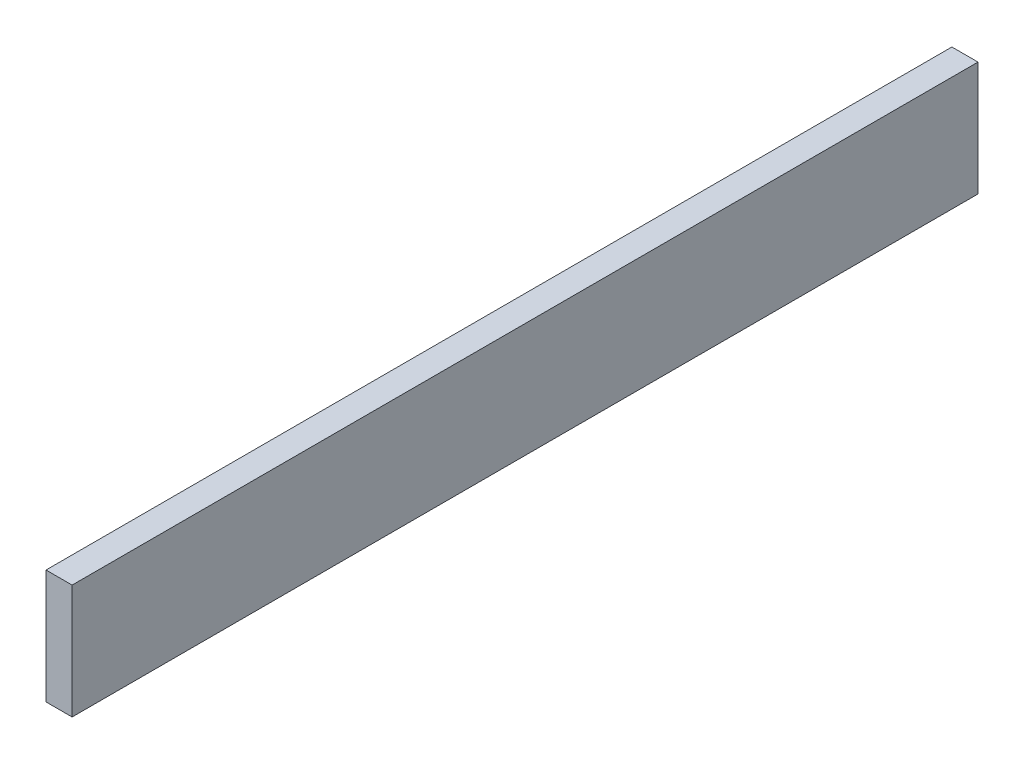
ISO-10303-21;
HEADER;
FILE_DESCRIPTION(('STEP AP214'),'2;1');
FILE_NAME('part.step','',(''),(''),'','','');
FILE_SCHEMA(('AUTOMOTIVE_DESIGN { 1 0 10303 214 1 1 1 1 }'));
ENDSEC;
DATA;
#1=APPLICATION_CONTEXT('core data for automotive mechanical design processes');
#2=APPLICATION_PROTOCOL_DEFINITION('international standard','automotive_design',2000,#1);
#3=PRODUCT_CONTEXT('',#1,'mechanical');
#4=PRODUCT('Part','Part','',(#3));
#5=PRODUCT_RELATED_PRODUCT_CATEGORY('part','',(#4));
#6=PRODUCT_DEFINITION_FORMATION('','',#4);
#7=PRODUCT_DEFINITION_CONTEXT('part definition',#1,'design');
#8=PRODUCT_DEFINITION('design','',#6,#7);
#9=PRODUCT_DEFINITION_SHAPE('','',#8);
#10=(LENGTH_UNIT() NAMED_UNIT(*) SI_UNIT(.MILLI.,.METRE.));
#11=(NAMED_UNIT(*) PLANE_ANGLE_UNIT() SI_UNIT($,.RADIAN.));
#12=(NAMED_UNIT(*) SI_UNIT($,.STERADIAN.) SOLID_ANGLE_UNIT());
#13=UNCERTAINTY_MEASURE_WITH_UNIT(LENGTH_MEASURE(1.E-05),#10,'distance_accuracy_value','');
#14=(GEOMETRIC_REPRESENTATION_CONTEXT(3) GLOBAL_UNCERTAINTY_ASSIGNED_CONTEXT((#13)) GLOBAL_UNIT_ASSIGNED_CONTEXT((#10,
#11,#12)) REPRESENTATION_CONTEXT('',''));
#15=CARTESIAN_POINT('',(0.,0.,0.));
#16=DIRECTION('',(0.,0.,1.));
#17=DIRECTION('',(1.,0.,0.));
#18=AXIS2_PLACEMENT_3D('',#15,#16,#17);
#19=CARTESIAN_POINT('',(16.,0.,0.));
#20=DIRECTION('',(0.,0.,-1.));
#21=DIRECTION('',(-1.,0.,0.));
#22=AXIS2_PLACEMENT_3D('',#19,#20,#21);
#23=PLANE('',#22);
#24=DIRECTION('',(0.,-1.,0.));
#25=VECTOR('',#24,1.);
#26=CARTESIAN_POINT('',(0.,0.,0.));
#27=LINE('',#26,#25);
#28=CARTESIAN_POINT('',(0.,70.,0.));
#29=VERTEX_POINT('',#28);
#30=CARTESIAN_POINT('',(0.,0.,0.));
#31=VERTEX_POINT('',#30);
#32=EDGE_CURVE('E95',#29,#31,#27,.T.);
#33=ORIENTED_EDGE('',*,*,#32,.T.);
#34=DIRECTION('',(-1.,0.,0.));
#35=VECTOR('',#34,1.);
#36=CARTESIAN_POINT('',(16.,0.,0.));
#37=LINE('',#36,#35);
#38=CARTESIAN_POINT('',(16.,0.,0.));
#39=VERTEX_POINT('',#38);
#40=EDGE_CURVE('E11',#39,#31,#37,.T.);
#41=ORIENTED_EDGE('',*,*,#40,.F.);
#42=DIRECTION('',(0.,-1.,0.));
#43=VECTOR('',#42,1.);
#44=CARTESIAN_POINT('',(16.,0.,0.));
#45=LINE('',#44,#43);
#46=CARTESIAN_POINT('',(16.,70.,0.));
#47=VERTEX_POINT('',#46);
#48=EDGE_CURVE('E83',#47,#39,#45,.T.);
#49=ORIENTED_EDGE('',*,*,#48,.F.);
#50=DIRECTION('',(-1.,0.,0.));
#51=VECTOR('',#50,1.);
#52=CARTESIAN_POINT('',(16.,70.,0.));
#53=LINE('',#52,#51);
#54=EDGE_CURVE('E91',#47,#29,#53,.T.);
#55=ORIENTED_EDGE('',*,*,#54,.T.);
#56=EDGE_LOOP('',(#33,#41,#49,#55));
#57=FACE_BOUND('',#56,.T.);
#58=ADVANCED_FACE('F32',(#57),#23,.F.);
#59=CARTESIAN_POINT('',(16.,0.,0.));
#60=DIRECTION('',(0.,1.,0.));
#61=DIRECTION('',(0.,0.,1.));
#62=AXIS2_PLACEMENT_3D('',#59,#60,#61);
#63=PLANE('',#62);
#64=DIRECTION('',(0.,0.,-1.));
#65=VECTOR('',#64,1.);
#66=CARTESIAN_POINT('',(0.,0.,0.));
#67=LINE('',#66,#65);
#68=CARTESIAN_POINT('',(0.,0.,-555.));
#69=VERTEX_POINT('',#68);
#70=EDGE_CURVE('E87',#31,#69,#67,.T.);
#71=ORIENTED_EDGE('',*,*,#70,.T.);
#72=DIRECTION('',(-1.,0.,0.));
#73=VECTOR('',#72,1.);
#74=CARTESIAN_POINT('',(16.,0.,-555.));
#75=LINE('',#74,#73);
#76=CARTESIAN_POINT('',(16.,0.,-555.));
#77=VERTEX_POINT('',#76);
#78=EDGE_CURVE('E40',#77,#69,#75,.T.);
#79=ORIENTED_EDGE('',*,*,#78,.F.);
#80=DIRECTION('',(0.,0.,-1.));
#81=VECTOR('',#80,1.);
#82=CARTESIAN_POINT('',(16.,0.,0.));
#83=LINE('',#82,#81);
#84=EDGE_CURVE('E78',#39,#77,#83,.T.);
#85=ORIENTED_EDGE('',*,*,#84,.F.);
#86=ORIENTED_EDGE('',*,*,#40,.T.);
#87=EDGE_LOOP('',(#71,#79,#85,#86));
#88=FACE_BOUND('',#87,.T.);
#89=ADVANCED_FACE('F86',(#88),#63,.F.);
#90=CARTESIAN_POINT('',(16.,0.,-555.));
#91=DIRECTION('',(0.,0.,1.));
#92=DIRECTION('',(1.,0.,0.));
#93=AXIS2_PLACEMENT_3D('',#90,#91,#92);
#94=PLANE('',#93);
#95=DIRECTION('',(0.,1.,0.));
#96=VECTOR('',#95,1.);
#97=CARTESIAN_POINT('',(0.,0.,-555.));
#98=LINE('',#97,#96);
#99=CARTESIAN_POINT('',(0.,70.,-555.));
#100=VERTEX_POINT('',#99);
#101=EDGE_CURVE('E65',#69,#100,#98,.T.);
#102=ORIENTED_EDGE('',*,*,#101,.T.);
#103=DIRECTION('',(-1.,0.,0.));
#104=VECTOR('',#103,1.);
#105=CARTESIAN_POINT('',(16.,70.,-555.));
#106=LINE('',#105,#104);
#107=CARTESIAN_POINT('',(16.,70.,-555.));
#108=VERTEX_POINT('',#107);
#109=EDGE_CURVE('E88',#108,#100,#106,.T.);
#110=ORIENTED_EDGE('',*,*,#109,.F.);
#111=DIRECTION('',(0.,1.,0.));
#112=VECTOR('',#111,1.);
#113=CARTESIAN_POINT('',(16.,0.,-555.));
#114=LINE('',#113,#112);
#115=EDGE_CURVE('E81',#77,#108,#114,.T.);
#116=ORIENTED_EDGE('',*,*,#115,.F.);
#117=ORIENTED_EDGE('',*,*,#78,.T.);
#118=EDGE_LOOP('',(#102,#110,#116,#117));
#119=FACE_BOUND('',#118,.T.);
#120=ADVANCED_FACE('F89',(#119),#94,.F.);
#121=CARTESIAN_POINT('',(16.,70.,0.));
#122=DIRECTION('',(0.,-1.,0.));
#123=DIRECTION('',(0.,0.,-1.));
#124=AXIS2_PLACEMENT_3D('',#121,#122,#123);
#125=PLANE('',#124);
#126=DIRECTION('',(0.,0.,1.));
#127=VECTOR('',#126,1.);
#128=CARTESIAN_POINT('',(0.,70.,0.));
#129=LINE('',#128,#127);
#130=EDGE_CURVE('E71',#100,#29,#129,.T.);
#131=ORIENTED_EDGE('',*,*,#130,.T.);
#132=ORIENTED_EDGE('',*,*,#54,.F.);
#133=DIRECTION('',(0.,0.,1.));
#134=VECTOR('',#133,1.);
#135=CARTESIAN_POINT('',(16.,70.,0.));
#136=LINE('',#135,#134);
#137=EDGE_CURVE('E48',#108,#47,#136,.T.);
#138=ORIENTED_EDGE('',*,*,#137,.F.);
#139=ORIENTED_EDGE('',*,*,#109,.T.);
#140=EDGE_LOOP('',(#131,#132,#138,#139));
#141=FACE_BOUND('',#140,.T.);
#142=ADVANCED_FACE('F102',(#141),#125,.F.);
#143=CARTESIAN_POINT('',(16.,0.,0.));
#144=DIRECTION('',(-1.,0.,0.));
#145=DIRECTION('',(0.,0.,1.));
#146=AXIS2_PLACEMENT_3D('',#143,#144,#145);
#147=PLANE('',#146);
#148=ORIENTED_EDGE('',*,*,#48,.T.);
#149=ORIENTED_EDGE('',*,*,#84,.T.);
#150=ORIENTED_EDGE('',*,*,#115,.T.);
#151=ORIENTED_EDGE('',*,*,#137,.T.);
#152=EDGE_LOOP('',(#148,#149,#150,#151));
#153=FACE_BOUND('',#152,.T.);
#154=ADVANCED_FACE('F79',(#153),#147,.F.);
#155=CARTESIAN_POINT('',(0.,0.,0.));
#156=DIRECTION('',(-1.,0.,0.));
#157=DIRECTION('',(0.,0.,1.));
#158=AXIS2_PLACEMENT_3D('',#155,#156,#157);
#159=PLANE('',#158);
#160=ORIENTED_EDGE('',*,*,#32,.F.);
#161=ORIENTED_EDGE('',*,*,#130,.F.);
#162=ORIENTED_EDGE('',*,*,#101,.F.);
#163=ORIENTED_EDGE('',*,*,#70,.F.);
#164=EDGE_LOOP('',(#160,#161,#162,#163));
#165=FACE_BOUND('',#164,.T.);
#166=ADVANCED_FACE('F105',(#165),#159,.T.);
#167=CLOSED_SHELL('',(#58,#89,#120,#142,#154,#166));
#168=MANIFOLD_SOLID_BREP('B2',#167);
#169=ADVANCED_BREP_SHAPE_REPRESENTATION('',(#18,#168),#14);
#170=SHAPE_DEFINITION_REPRESENTATION(#9,#169);
ENDSEC;
END-ISO-10303-21;
